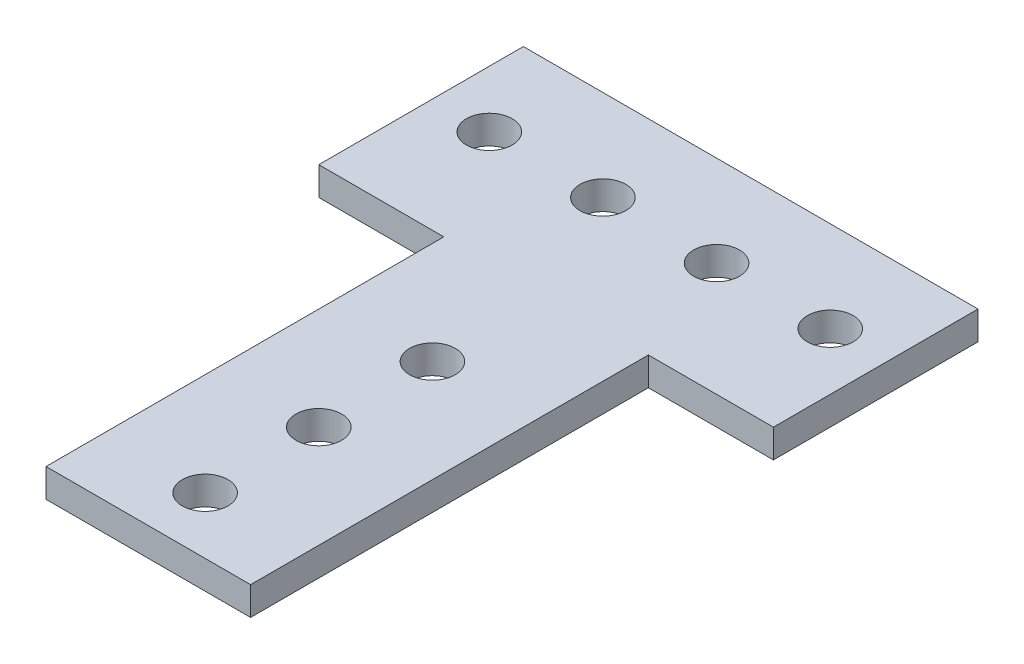
ISO-10303-21;
HEADER;
FILE_DESCRIPTION(('STEP AP214'),'2;1');
FILE_NAME('part.step','',(''),(''),'','','');
FILE_SCHEMA(('AUTOMOTIVE_DESIGN { 1 0 10303 214 1 1 1 1 }'));
ENDSEC;
DATA;
#1=APPLICATION_CONTEXT('core data for automotive mechanical design processes');
#2=APPLICATION_PROTOCOL_DEFINITION('international standard','automotive_design',2000,#1);
#3=PRODUCT_CONTEXT('',#1,'mechanical');
#4=PRODUCT('Part','Part','',(#3));
#5=PRODUCT_RELATED_PRODUCT_CATEGORY('part','',(#4));
#6=PRODUCT_DEFINITION_FORMATION('','',#4);
#7=PRODUCT_DEFINITION_CONTEXT('part definition',#1,'design');
#8=PRODUCT_DEFINITION('design','',#6,#7);
#9=PRODUCT_DEFINITION_SHAPE('','',#8);
#10=(LENGTH_UNIT() NAMED_UNIT(*) SI_UNIT(.MILLI.,.METRE.));
#11=(NAMED_UNIT(*) PLANE_ANGLE_UNIT() SI_UNIT($,.RADIAN.));
#12=(NAMED_UNIT(*) SI_UNIT($,.STERADIAN.) SOLID_ANGLE_UNIT());
#13=UNCERTAINTY_MEASURE_WITH_UNIT(LENGTH_MEASURE(1.E-05),#10,'distance_accuracy_value','');
#14=(GEOMETRIC_REPRESENTATION_CONTEXT(3) GLOBAL_UNCERTAINTY_ASSIGNED_CONTEXT((#13)) GLOBAL_UNIT_ASSIGNED_CONTEXT((#10,
#11,#12)) REPRESENTATION_CONTEXT('',''));
#15=CARTESIAN_POINT('',(0.,0.,0.));
#16=DIRECTION('',(0.,0.,1.));
#17=DIRECTION('',(1.,0.,0.));
#18=AXIS2_PLACEMENT_3D('',#15,#16,#17);
#19=CARTESIAN_POINT('',(22.86,3.175,0.));
#20=DIRECTION('',(0.,0.,-1.));
#21=DIRECTION('',(-1.,0.,0.));
#22=AXIS2_PLACEMENT_3D('',#19,#20,#21);
#23=PLANE('',#22);
#24=DIRECTION('',(1.,0.,0.));
#25=VECTOR('',#24,1.);
#26=CARTESIAN_POINT('',(22.86,0.,0.));
#27=LINE('',#26,#25);
#28=CARTESIAN_POINT('',(0.,0.,0.));
#29=VERTEX_POINT('',#28);
#30=CARTESIAN_POINT('',(22.86,0.,0.));
#31=VERTEX_POINT('',#30);
#32=EDGE_CURVE('E130',#29,#31,#27,.T.);
#33=ORIENTED_EDGE('',*,*,#32,.T.);
#34=DIRECTION('',(0.,-1.,0.));
#35=VECTOR('',#34,1.);
#36=CARTESIAN_POINT('',(22.86,3.175,0.));
#37=LINE('',#36,#35);
#38=CARTESIAN_POINT('',(22.86,3.175,0.));
#39=VERTEX_POINT('',#38);
#40=EDGE_CURVE('E11',#39,#31,#37,.T.);
#41=ORIENTED_EDGE('',*,*,#40,.F.);
#42=DIRECTION('',(1.,0.,0.));
#43=VECTOR('',#42,1.);
#44=CARTESIAN_POINT('',(22.86,3.175,0.));
#45=LINE('',#44,#43);
#46=CARTESIAN_POINT('',(0.,3.175,0.));
#47=VERTEX_POINT('',#46);
#48=EDGE_CURVE('E145',#47,#39,#45,.T.);
#49=ORIENTED_EDGE('',*,*,#48,.F.);
#50=DIRECTION('',(0.,-1.,0.));
#51=VECTOR('',#50,1.);
#52=CARTESIAN_POINT('',(0.,3.175,0.));
#53=LINE('',#52,#51);
#54=EDGE_CURVE('E126',#47,#29,#53,.T.);
#55=ORIENTED_EDGE('',*,*,#54,.T.);
#56=EDGE_LOOP('',(#33,#41,#49,#55));
#57=FACE_BOUND('',#56,.T.);
#58=ADVANCED_FACE('F34',(#57),#23,.F.);
#59=CARTESIAN_POINT('',(22.86,3.175,-44.45));
#60=DIRECTION('',(-1.,0.,0.));
#61=DIRECTION('',(0.,0.,1.));
#62=AXIS2_PLACEMENT_3D('',#59,#60,#61);
#63=PLANE('',#62);
#64=DIRECTION('',(0.,0.,-1.));
#65=VECTOR('',#64,1.);
#66=CARTESIAN_POINT('',(22.86,0.,-44.45));
#67=LINE('',#66,#65);
#68=CARTESIAN_POINT('',(22.86,0.,-44.45));
#69=VERTEX_POINT('',#68);
#70=EDGE_CURVE('E133',#31,#69,#67,.T.);
#71=ORIENTED_EDGE('',*,*,#70,.T.);
#72=DIRECTION('',(0.,-1.,0.));
#73=VECTOR('',#72,1.);
#74=CARTESIAN_POINT('',(22.86,3.175,-44.45));
#75=LINE('',#74,#73);
#76=CARTESIAN_POINT('',(22.86,3.175,-44.45));
#77=VERTEX_POINT('',#76);
#78=EDGE_CURVE('E42',#77,#69,#75,.T.);
#79=ORIENTED_EDGE('',*,*,#78,.F.);
#80=DIRECTION('',(0.,0.,-1.));
#81=VECTOR('',#80,1.);
#82=CARTESIAN_POINT('',(22.86,3.175,-44.45));
#83=LINE('',#82,#81);
#84=EDGE_CURVE('E93',#39,#77,#83,.T.);
#85=ORIENTED_EDGE('',*,*,#84,.F.);
#86=ORIENTED_EDGE('',*,*,#40,.T.);
#87=EDGE_LOOP('',(#71,#79,#85,#86));
#88=FACE_BOUND('',#87,.T.);
#89=ADVANCED_FACE('F260',(#88),#63,.F.);
#90=CARTESIAN_POINT('',(36.83,3.175,-44.45));
#91=DIRECTION('',(0.,0.,-1.));
#92=DIRECTION('',(-1.,0.,0.));
#93=AXIS2_PLACEMENT_3D('',#90,#91,#92);
#94=PLANE('',#93);
#95=DIRECTION('',(1.,0.,0.));
#96=VECTOR('',#95,1.);
#97=CARTESIAN_POINT('',(36.83,0.,-44.45));
#98=LINE('',#97,#96);
#99=CARTESIAN_POINT('',(36.83,0.,-44.45));
#100=VERTEX_POINT('',#99);
#101=EDGE_CURVE('E136',#69,#100,#98,.T.);
#102=ORIENTED_EDGE('',*,*,#101,.T.);
#103=DIRECTION('',(0.,-1.,0.));
#104=VECTOR('',#103,1.);
#105=CARTESIAN_POINT('',(36.83,3.175,-44.45));
#106=LINE('',#105,#104);
#107=CARTESIAN_POINT('',(36.83,3.175,-44.45));
#108=VERTEX_POINT('',#107);
#109=EDGE_CURVE('E152',#108,#100,#106,.T.);
#110=ORIENTED_EDGE('',*,*,#109,.F.);
#111=DIRECTION('',(1.,0.,0.));
#112=VECTOR('',#111,1.);
#113=CARTESIAN_POINT('',(36.83,3.175,-44.45));
#114=LINE('',#113,#112);
#115=EDGE_CURVE('E160',#77,#108,#114,.T.);
#116=ORIENTED_EDGE('',*,*,#115,.F.);
#117=ORIENTED_EDGE('',*,*,#78,.T.);
#118=EDGE_LOOP('',(#102,#110,#116,#117));
#119=FACE_BOUND('',#118,.T.);
#120=ADVANCED_FACE('F158',(#119),#94,.F.);
#121=CARTESIAN_POINT('',(36.83,3.175,-67.31));
#122=DIRECTION('',(-1.,0.,0.));
#123=DIRECTION('',(0.,0.,1.));
#124=AXIS2_PLACEMENT_3D('',#121,#122,#123);
#125=PLANE('',#124);
#126=DIRECTION('',(0.,0.,-1.));
#127=VECTOR('',#126,1.);
#128=CARTESIAN_POINT('',(36.83,0.,-67.31));
#129=LINE('',#128,#127);
#130=CARTESIAN_POINT('',(36.83,0.,-67.31));
#131=VERTEX_POINT('',#130);
#132=EDGE_CURVE('E138',#100,#131,#129,.T.);
#133=ORIENTED_EDGE('',*,*,#132,.T.);
#134=DIRECTION('',(0.,-1.,0.));
#135=VECTOR('',#134,1.);
#136=CARTESIAN_POINT('',(36.83,3.175,-67.31));
#137=LINE('',#136,#135);
#138=CARTESIAN_POINT('',(36.83,3.175,-67.31));
#139=VERTEX_POINT('',#138);
#140=EDGE_CURVE('E149',#139,#131,#137,.T.);
#141=ORIENTED_EDGE('',*,*,#140,.F.);
#142=DIRECTION('',(0.,0.,-1.));
#143=VECTOR('',#142,1.);
#144=CARTESIAN_POINT('',(36.83,3.175,-67.31));
#145=LINE('',#144,#143);
#146=EDGE_CURVE('E172',#108,#139,#145,.T.);
#147=ORIENTED_EDGE('',*,*,#146,.F.);
#148=ORIENTED_EDGE('',*,*,#109,.T.);
#149=EDGE_LOOP('',(#133,#141,#147,#148));
#150=FACE_BOUND('',#149,.T.);
#151=ADVANCED_FACE('F168',(#150),#125,.F.);
#152=CARTESIAN_POINT('',(-13.97,3.175,-67.31));
#153=DIRECTION('',(0.,0.,1.));
#154=DIRECTION('',(1.,0.,0.));
#155=AXIS2_PLACEMENT_3D('',#152,#153,#154);
#156=PLANE('',#155);
#157=DIRECTION('',(-1.,0.,0.));
#158=VECTOR('',#157,1.);
#159=CARTESIAN_POINT('',(-13.97,0.,-67.31));
#160=LINE('',#159,#158);
#161=CARTESIAN_POINT('',(-13.97,0.,-67.31));
#162=VERTEX_POINT('',#161);
#163=EDGE_CURVE('E140',#131,#162,#160,.T.);
#164=ORIENTED_EDGE('',*,*,#163,.T.);
#165=DIRECTION('',(0.,-1.,0.));
#166=VECTOR('',#165,1.);
#167=CARTESIAN_POINT('',(-13.97,3.175,-67.31));
#168=LINE('',#167,#166);
#169=CARTESIAN_POINT('',(-13.97,3.175,-67.31));
#170=VERTEX_POINT('',#169);
#171=EDGE_CURVE('E121',#170,#162,#168,.T.);
#172=ORIENTED_EDGE('',*,*,#171,.F.);
#173=DIRECTION('',(-1.,0.,0.));
#174=VECTOR('',#173,1.);
#175=CARTESIAN_POINT('',(-13.97,3.175,-67.31));
#176=LINE('',#175,#174);
#177=EDGE_CURVE('E112',#139,#170,#176,.T.);
#178=ORIENTED_EDGE('',*,*,#177,.F.);
#179=ORIENTED_EDGE('',*,*,#140,.T.);
#180=EDGE_LOOP('',(#164,#172,#178,#179));
#181=FACE_BOUND('',#180,.T.);
#182=ADVANCED_FACE('F171',(#181),#156,.F.);
#183=CARTESIAN_POINT('',(-13.97,3.175,-44.45));
#184=DIRECTION('',(1.,0.,0.));
#185=DIRECTION('',(0.,0.,-1.));
#186=AXIS2_PLACEMENT_3D('',#183,#184,#185);
#187=PLANE('',#186);
#188=DIRECTION('',(0.,0.,1.));
#189=VECTOR('',#188,1.);
#190=CARTESIAN_POINT('',(-13.97,0.,-44.45));
#191=LINE('',#190,#189);
#192=CARTESIAN_POINT('',(-13.97,0.,-44.45));
#193=VERTEX_POINT('',#192);
#194=EDGE_CURVE('E120',#162,#193,#191,.T.);
#195=ORIENTED_EDGE('',*,*,#194,.T.);
#196=DIRECTION('',(0.,-1.,0.));
#197=VECTOR('',#196,1.);
#198=CARTESIAN_POINT('',(-13.97,3.175,-44.45));
#199=LINE('',#198,#197);
#200=CARTESIAN_POINT('',(-13.97,3.175,-44.45));
#201=VERTEX_POINT('',#200);
#202=EDGE_CURVE('E117',#201,#193,#199,.T.);
#203=ORIENTED_EDGE('',*,*,#202,.F.);
#204=DIRECTION('',(0.,0.,1.));
#205=VECTOR('',#204,1.);
#206=CARTESIAN_POINT('',(-13.97,3.175,-44.45));
#207=LINE('',#206,#205);
#208=EDGE_CURVE('E106',#170,#201,#207,.T.);
#209=ORIENTED_EDGE('',*,*,#208,.F.);
#210=ORIENTED_EDGE('',*,*,#171,.T.);
#211=EDGE_LOOP('',(#195,#203,#209,#210));
#212=FACE_BOUND('',#211,.T.);
#213=ADVANCED_FACE('F118',(#212),#187,.F.);
#214=CARTESIAN_POINT('',(0.,3.175,-44.45));
#215=DIRECTION('',(0.,0.,-1.));
#216=DIRECTION('',(-1.,0.,0.));
#217=AXIS2_PLACEMENT_3D('',#214,#215,#216);
#218=PLANE('',#217);
#219=DIRECTION('',(1.,0.,0.));
#220=VECTOR('',#219,1.);
#221=CARTESIAN_POINT('',(0.,0.,-44.45));
#222=LINE('',#221,#220);
#223=CARTESIAN_POINT('',(0.,0.,-44.45));
#224=VERTEX_POINT('',#223);
#225=EDGE_CURVE('E79',#193,#224,#222,.T.);
#226=ORIENTED_EDGE('',*,*,#225,.T.);
#227=DIRECTION('',(0.,-1.,0.));
#228=VECTOR('',#227,1.);
#229=CARTESIAN_POINT('',(0.,3.175,-44.45));
#230=LINE('',#229,#228);
#231=CARTESIAN_POINT('',(0.,3.175,-44.45));
#232=VERTEX_POINT('',#231);
#233=EDGE_CURVE('E122',#232,#224,#230,.T.);
#234=ORIENTED_EDGE('',*,*,#233,.F.);
#235=DIRECTION('',(1.,0.,0.));
#236=VECTOR('',#235,1.);
#237=CARTESIAN_POINT('',(0.,3.175,-44.45));
#238=LINE('',#237,#236);
#239=EDGE_CURVE('E110',#201,#232,#238,.T.);
#240=ORIENTED_EDGE('',*,*,#239,.F.);
#241=ORIENTED_EDGE('',*,*,#202,.T.);
#242=EDGE_LOOP('',(#226,#234,#240,#241));
#243=FACE_BOUND('',#242,.T.);
#244=ADVANCED_FACE('F124',(#243),#218,.F.);
#245=CARTESIAN_POINT('',(0.,3.175,0.));
#246=DIRECTION('',(1.,0.,0.));
#247=DIRECTION('',(0.,0.,-1.));
#248=AXIS2_PLACEMENT_3D('',#245,#246,#247);
#249=PLANE('',#248);
#250=DIRECTION('',(0.,0.,1.));
#251=VECTOR('',#250,1.);
#252=CARTESIAN_POINT('',(0.,0.,0.));
#253=LINE('',#252,#251);
#254=EDGE_CURVE('E85',#224,#29,#253,.T.);
#255=ORIENTED_EDGE('',*,*,#254,.T.);
#256=ORIENTED_EDGE('',*,*,#54,.F.);
#257=DIRECTION('',(0.,0.,1.));
#258=VECTOR('',#257,1.);
#259=CARTESIAN_POINT('',(0.,3.175,0.));
#260=LINE('',#259,#258);
#261=EDGE_CURVE('E50',#232,#47,#260,.T.);
#262=ORIENTED_EDGE('',*,*,#261,.F.);
#263=ORIENTED_EDGE('',*,*,#233,.T.);
#264=EDGE_LOOP('',(#255,#256,#262,#263));
#265=FACE_BOUND('',#264,.T.);
#266=ADVANCED_FACE('F231',(#265),#249,.F.);
#267=CARTESIAN_POINT('',(0.,3.175,0.));
#268=DIRECTION('',(0.,-1.,0.));
#269=DIRECTION('',(0.,0.,-1.));
#270=AXIS2_PLACEMENT_3D('',#267,#268,#269);
#271=PLANE('',#270);
#272=CARTESIAN_POINT('',(11.43,3.175,-31.75));
#273=DIRECTION('',(0.,1.,0.));
#274=DIRECTION('',(0.,0.,1.));
#275=AXIS2_PLACEMENT_3D('',#272,#273,#274);
#276=CIRCLE('',#275,2.5527);
#277=CARTESIAN_POINT('',(11.43,3.175,-29.1973));
#278=VERTEX_POINT('',#277);
#279=EDGE_CURVE('E214',#278,#278,#276,.T.);
#280=ORIENTED_EDGE('',*,*,#279,.F.);
#281=EDGE_LOOP('',(#280));
#282=FACE_BOUND('',#281,.T.);
#283=CARTESIAN_POINT('',(11.43,3.175,-19.05));
#284=DIRECTION('',(0.,1.,0.));
#285=DIRECTION('',(0.,0.,1.));
#286=AXIS2_PLACEMENT_3D('',#283,#284,#285);
#287=CIRCLE('',#286,2.5527);
#288=CARTESIAN_POINT('',(11.43,3.175,-16.4973));
#289=VERTEX_POINT('',#288);
#290=EDGE_CURVE('E208',#289,#289,#287,.T.);
#291=ORIENTED_EDGE('',*,*,#290,.F.);
#292=EDGE_LOOP('',(#291));
#293=FACE_BOUND('',#292,.T.);
#294=CARTESIAN_POINT('',(11.429999999999,3.175,-6.35));
#295=DIRECTION('',(0.,1.,0.));
#296=DIRECTION('',(0.,0.,1.));
#297=AXIS2_PLACEMENT_3D('',#294,#295,#296);
#298=CIRCLE('',#297,2.5527);
#299=CARTESIAN_POINT('',(11.429999999999,3.175,-3.7973));
#300=VERTEX_POINT('',#299);
#301=EDGE_CURVE('E202',#300,#300,#298,.T.);
#302=ORIENTED_EDGE('',*,*,#301,.F.);
#303=EDGE_LOOP('',(#302));
#304=FACE_BOUND('',#303,.T.);
#305=CARTESIAN_POINT('',(-7.61999999999999,3.175,-57.15));
#306=DIRECTION('',(0.,1.,0.));
#307=DIRECTION('',(0.,0.,1.));
#308=AXIS2_PLACEMENT_3D('',#305,#306,#307);
#309=CIRCLE('',#308,2.5527);
#310=CARTESIAN_POINT('',(-7.61999999999999,3.175,-54.5973));
#311=VERTEX_POINT('',#310);
#312=EDGE_CURVE('E197',#311,#311,#309,.T.);
#313=ORIENTED_EDGE('',*,*,#312,.F.);
#314=EDGE_LOOP('',(#313));
#315=FACE_BOUND('',#314,.T.);
#316=CARTESIAN_POINT('',(5.08000000000001,3.175,-57.15));
#317=DIRECTION('',(0.,1.,0.));
#318=DIRECTION('',(0.,0.,1.));
#319=AXIS2_PLACEMENT_3D('',#316,#317,#318);
#320=CIRCLE('',#319,2.5527);
#321=CARTESIAN_POINT('',(5.08000000000001,3.175,-54.5973));
#322=VERTEX_POINT('',#321);
#323=EDGE_CURVE('E191',#322,#322,#320,.T.);
#324=ORIENTED_EDGE('',*,*,#323,.F.);
#325=EDGE_LOOP('',(#324));
#326=FACE_BOUND('',#325,.T.);
#327=CARTESIAN_POINT('',(17.78,3.175,-57.15));
#328=DIRECTION('',(0.,1.,0.));
#329=DIRECTION('',(0.,0.,1.));
#330=AXIS2_PLACEMENT_3D('',#327,#328,#329);
#331=CIRCLE('',#330,2.5527);
#332=CARTESIAN_POINT('',(17.78,3.175,-54.5973));
#333=VERTEX_POINT('',#332);
#334=EDGE_CURVE('E185',#333,#333,#331,.T.);
#335=ORIENTED_EDGE('',*,*,#334,.F.);
#336=EDGE_LOOP('',(#335));
#337=FACE_BOUND('',#336,.T.);
#338=CARTESIAN_POINT('',(30.48,3.175,-57.15));
#339=DIRECTION('',(0.,1.,0.));
#340=DIRECTION('',(0.,0.,1.));
#341=AXIS2_PLACEMENT_3D('',#338,#339,#340);
#342=CIRCLE('',#341,2.55269999999999);
#343=CARTESIAN_POINT('',(30.48,3.175,-54.5973));
#344=VERTEX_POINT('',#343);
#345=EDGE_CURVE('E178',#344,#344,#342,.T.);
#346=ORIENTED_EDGE('',*,*,#345,.F.);
#347=EDGE_LOOP('',(#346));
#348=FACE_BOUND('',#347,.T.);
#349=ORIENTED_EDGE('',*,*,#48,.T.);
#350=ORIENTED_EDGE('',*,*,#84,.T.);
#351=ORIENTED_EDGE('',*,*,#115,.T.);
#352=ORIENTED_EDGE('',*,*,#146,.T.);
#353=ORIENTED_EDGE('',*,*,#177,.T.);
#354=ORIENTED_EDGE('',*,*,#208,.T.);
#355=ORIENTED_EDGE('',*,*,#239,.T.);
#356=ORIENTED_EDGE('',*,*,#261,.T.);
#357=EDGE_LOOP('',(#349,#350,#351,#352,#353,#354,#355,#356));
#358=FACE_BOUND('',#357,.T.);
#359=ADVANCED_FACE('F108',(#282,#293,#304,#315,#326,#337,#348,#358),#271,.F.);
#360=CARTESIAN_POINT('',(0.,0.,0.));
#361=DIRECTION('',(0.,-1.,0.));
#362=DIRECTION('',(0.,0.,-1.));
#363=AXIS2_PLACEMENT_3D('',#360,#361,#362);
#364=PLANE('',#363);
#365=CARTESIAN_POINT('',(11.43,0.,-31.75));
#366=DIRECTION('',(0.,1.,0.));
#367=DIRECTION('',(0.,0.,1.));
#368=AXIS2_PLACEMENT_3D('',#365,#366,#367);
#369=CIRCLE('',#368,2.5527);
#370=CARTESIAN_POINT('',(11.43,0.,-29.1973));
#371=VERTEX_POINT('',#370);
#372=EDGE_CURVE('E182',#371,#371,#369,.T.);
#373=ORIENTED_EDGE('',*,*,#372,.T.);
#374=EDGE_LOOP('',(#373));
#375=FACE_BOUND('',#374,.T.);
#376=CARTESIAN_POINT('',(11.43,0.,-19.05));
#377=DIRECTION('',(0.,1.,0.));
#378=DIRECTION('',(0.,0.,1.));
#379=AXIS2_PLACEMENT_3D('',#376,#377,#378);
#380=CIRCLE('',#379,2.5527);
#381=CARTESIAN_POINT('',(11.43,0.,-16.4973));
#382=VERTEX_POINT('',#381);
#383=EDGE_CURVE('E211',#382,#382,#380,.T.);
#384=ORIENTED_EDGE('',*,*,#383,.T.);
#385=EDGE_LOOP('',(#384));
#386=FACE_BOUND('',#385,.T.);
#387=CARTESIAN_POINT('',(11.429999999999,0.,-6.35));
#388=DIRECTION('',(0.,1.,0.));
#389=DIRECTION('',(0.,0.,1.));
#390=AXIS2_PLACEMENT_3D('',#387,#388,#389);
#391=CIRCLE('',#390,2.5527);
#392=CARTESIAN_POINT('',(11.429999999999,0.,-3.7973));
#393=VERTEX_POINT('',#392);
#394=EDGE_CURVE('E205',#393,#393,#391,.T.);
#395=ORIENTED_EDGE('',*,*,#394,.T.);
#396=EDGE_LOOP('',(#395));
#397=FACE_BOUND('',#396,.T.);
#398=CARTESIAN_POINT('',(-7.61999999999999,0.,-57.15));
#399=DIRECTION('',(0.,1.,0.));
#400=DIRECTION('',(0.,0.,1.));
#401=AXIS2_PLACEMENT_3D('',#398,#399,#400);
#402=CIRCLE('',#401,2.5527);
#403=CARTESIAN_POINT('',(-7.61999999999999,0.,-54.5973));
#404=VERTEX_POINT('',#403);
#405=EDGE_CURVE('E134',#404,#404,#402,.T.);
#406=ORIENTED_EDGE('',*,*,#405,.T.);
#407=EDGE_LOOP('',(#406));
#408=FACE_BOUND('',#407,.T.);
#409=CARTESIAN_POINT('',(5.08000000000001,0.,-57.15));
#410=DIRECTION('',(0.,1.,0.));
#411=DIRECTION('',(0.,0.,1.));
#412=AXIS2_PLACEMENT_3D('',#409,#410,#411);
#413=CIRCLE('',#412,2.5527);
#414=CARTESIAN_POINT('',(5.08000000000001,0.,-54.5973));
#415=VERTEX_POINT('',#414);
#416=EDGE_CURVE('E194',#415,#415,#413,.T.);
#417=ORIENTED_EDGE('',*,*,#416,.T.);
#418=EDGE_LOOP('',(#417));
#419=FACE_BOUND('',#418,.T.);
#420=CARTESIAN_POINT('',(17.78,0.,-57.15));
#421=DIRECTION('',(0.,1.,0.));
#422=DIRECTION('',(0.,0.,1.));
#423=AXIS2_PLACEMENT_3D('',#420,#421,#422);
#424=CIRCLE('',#423,2.5527);
#425=CARTESIAN_POINT('',(17.78,0.,-54.5973));
#426=VERTEX_POINT('',#425);
#427=EDGE_CURVE('E188',#426,#426,#424,.T.);
#428=ORIENTED_EDGE('',*,*,#427,.T.);
#429=EDGE_LOOP('',(#428));
#430=FACE_BOUND('',#429,.T.);
#431=CARTESIAN_POINT('',(30.48,0.,-57.15));
#432=DIRECTION('',(0.,1.,0.));
#433=DIRECTION('',(0.,0.,1.));
#434=AXIS2_PLACEMENT_3D('',#431,#432,#433);
#435=CIRCLE('',#434,2.55269999999999);
#436=CARTESIAN_POINT('',(30.48,0.,-54.5973));
#437=VERTEX_POINT('',#436);
#438=EDGE_CURVE('E181',#437,#437,#435,.T.);
#439=ORIENTED_EDGE('',*,*,#438,.T.);
#440=EDGE_LOOP('',(#439));
#441=FACE_BOUND('',#440,.T.);
#442=ORIENTED_EDGE('',*,*,#32,.F.);
#443=ORIENTED_EDGE('',*,*,#254,.F.);
#444=ORIENTED_EDGE('',*,*,#225,.F.);
#445=ORIENTED_EDGE('',*,*,#194,.F.);
#446=ORIENTED_EDGE('',*,*,#163,.F.);
#447=ORIENTED_EDGE('',*,*,#132,.F.);
#448=ORIENTED_EDGE('',*,*,#101,.F.);
#449=ORIENTED_EDGE('',*,*,#70,.F.);
#450=EDGE_LOOP('',(#442,#443,#444,#445,#446,#447,#448,#449));
#451=FACE_BOUND('',#450,.T.);
#452=ADVANCED_FACE('F164',(#375,#386,#397,#408,#419,#430,#441,#451),#364,.T.);
#453=CARTESIAN_POINT('',(30.48,0.,-57.15));
#454=DIRECTION('',(0.,1.,0.));
#455=DIRECTION('',(0.,0.,1.));
#456=AXIS2_PLACEMENT_3D('',#453,#454,#455);
#457=CYLINDRICAL_SURFACE('',#456,2.55269999999999);
#458=ORIENTED_EDGE('',*,*,#438,.F.);
#459=EDGE_LOOP('',(#458));
#460=FACE_BOUND('',#459,.T.);
#461=ORIENTED_EDGE('',*,*,#345,.T.);
#462=EDGE_LOOP('',(#461));
#463=FACE_BOUND('',#462,.T.);
#464=ADVANCED_FACE('F245',(#460,#463),#457,.F.);
#465=CARTESIAN_POINT('',(17.78,0.,-57.15));
#466=DIRECTION('',(0.,1.,0.));
#467=DIRECTION('',(0.,0.,1.));
#468=AXIS2_PLACEMENT_3D('',#465,#466,#467);
#469=CYLINDRICAL_SURFACE('',#468,2.5527);
#470=ORIENTED_EDGE('',*,*,#427,.F.);
#471=EDGE_LOOP('',(#470));
#472=FACE_BOUND('',#471,.T.);
#473=ORIENTED_EDGE('',*,*,#334,.T.);
#474=EDGE_LOOP('',(#473));
#475=FACE_BOUND('',#474,.T.);
#476=ADVANCED_FACE('F247',(#472,#475),#469,.F.);
#477=CARTESIAN_POINT('',(5.08000000000001,0.,-57.15));
#478=DIRECTION('',(0.,1.,0.));
#479=DIRECTION('',(0.,0.,1.));
#480=AXIS2_PLACEMENT_3D('',#477,#478,#479);
#481=CYLINDRICAL_SURFACE('',#480,2.5527);
#482=ORIENTED_EDGE('',*,*,#416,.F.);
#483=EDGE_LOOP('',(#482));
#484=FACE_BOUND('',#483,.T.);
#485=ORIENTED_EDGE('',*,*,#323,.T.);
#486=EDGE_LOOP('',(#485));
#487=FACE_BOUND('',#486,.T.);
#488=ADVANCED_FACE('F254',(#484,#487),#481,.F.);
#489=CARTESIAN_POINT('',(-7.61999999999999,0.,-57.15));
#490=DIRECTION('',(0.,1.,0.));
#491=DIRECTION('',(0.,0.,1.));
#492=AXIS2_PLACEMENT_3D('',#489,#490,#491);
#493=CYLINDRICAL_SURFACE('',#492,2.5527);
#494=ORIENTED_EDGE('',*,*,#405,.F.);
#495=EDGE_LOOP('',(#494));
#496=FACE_BOUND('',#495,.T.);
#497=ORIENTED_EDGE('',*,*,#312,.T.);
#498=EDGE_LOOP('',(#497));
#499=FACE_BOUND('',#498,.T.);
#500=ADVANCED_FACE('F326',(#496,#499),#493,.F.);
#501=CARTESIAN_POINT('',(11.429999999999,0.,-6.35));
#502=DIRECTION('',(0.,1.,0.));
#503=DIRECTION('',(0.,0.,1.));
#504=AXIS2_PLACEMENT_3D('',#501,#502,#503);
#505=CYLINDRICAL_SURFACE('',#504,2.5527);
#506=ORIENTED_EDGE('',*,*,#394,.F.);
#507=EDGE_LOOP('',(#506));
#508=FACE_BOUND('',#507,.T.);
#509=ORIENTED_EDGE('',*,*,#301,.T.);
#510=EDGE_LOOP('',(#509));
#511=FACE_BOUND('',#510,.T.);
#512=ADVANCED_FACE('F336',(#508,#511),#505,.F.);
#513=CARTESIAN_POINT('',(11.43,0.,-19.05));
#514=DIRECTION('',(0.,1.,0.));
#515=DIRECTION('',(0.,0.,1.));
#516=AXIS2_PLACEMENT_3D('',#513,#514,#515);
#517=CYLINDRICAL_SURFACE('',#516,2.5527);
#518=ORIENTED_EDGE('',*,*,#383,.F.);
#519=EDGE_LOOP('',(#518));
#520=FACE_BOUND('',#519,.T.);
#521=ORIENTED_EDGE('',*,*,#290,.T.);
#522=EDGE_LOOP('',(#521));
#523=FACE_BOUND('',#522,.T.);
#524=ADVANCED_FACE('F225',(#520,#523),#517,.F.);
#525=CARTESIAN_POINT('',(11.43,0.,-31.75));
#526=DIRECTION('',(0.,1.,0.));
#527=DIRECTION('',(0.,0.,1.));
#528=AXIS2_PLACEMENT_3D('',#525,#526,#527);
#529=CYLINDRICAL_SURFACE('',#528,2.5527);
#530=ORIENTED_EDGE('',*,*,#372,.F.);
#531=EDGE_LOOP('',(#530));
#532=FACE_BOUND('',#531,.T.);
#533=ORIENTED_EDGE('',*,*,#279,.T.);
#534=EDGE_LOOP('',(#533));
#535=FACE_BOUND('',#534,.T.);
#536=ADVANCED_FACE('F222',(#532,#535),#529,.F.);
#537=CLOSED_SHELL('',(#58,#89,#120,#151,#182,#213,#244,#266,#359,#452,#464,#476,#488,#500,#512,
#524,#536));
#538=MANIFOLD_SOLID_BREP('B2',#537);
#539=ADVANCED_BREP_SHAPE_REPRESENTATION('',(#18,#538),#14);
#540=SHAPE_DEFINITION_REPRESENTATION(#9,#539);
ENDSEC;
END-ISO-10303-21;
